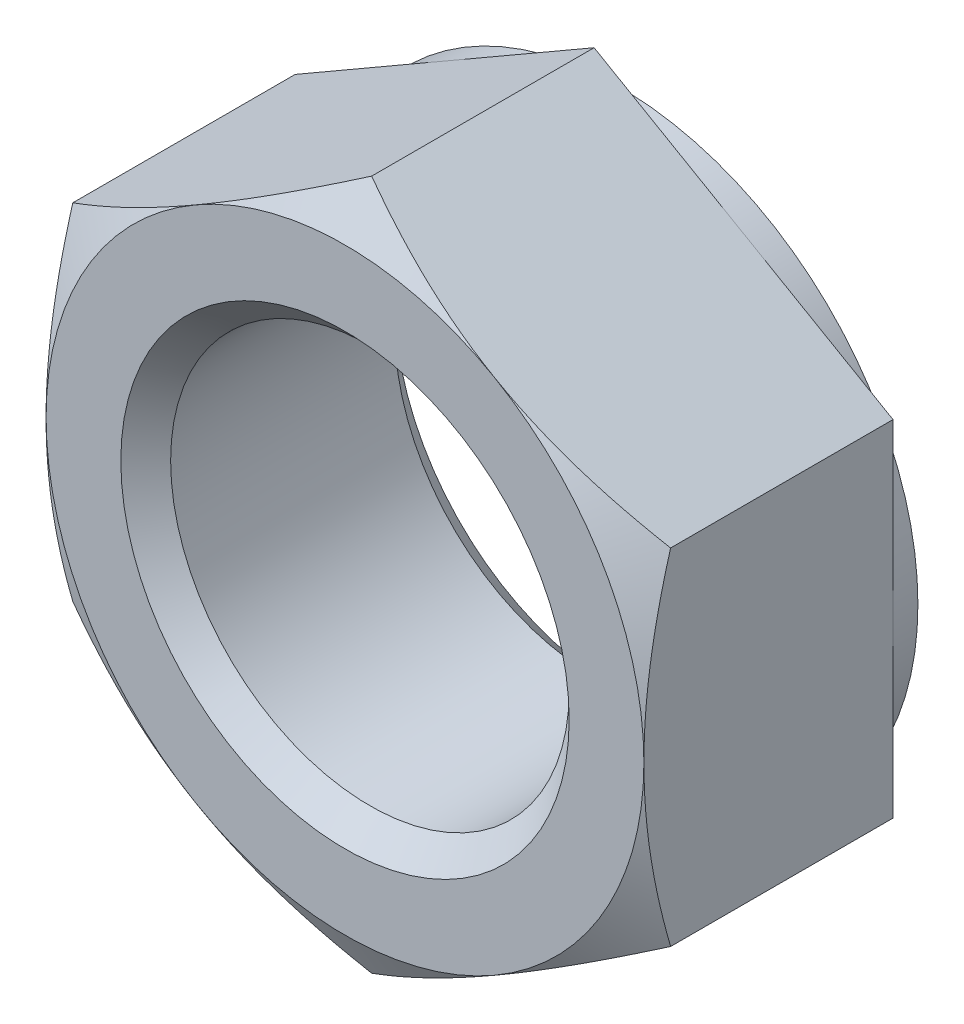
ISO-10303-21;
HEADER;
FILE_DESCRIPTION(('STEP AP214'),'2;1');
FILE_NAME('part.step','',(''),(''),'','','');
FILE_SCHEMA(('AUTOMOTIVE_DESIGN { 1 0 10303 214 1 1 1 1 }'));
ENDSEC;
DATA;
#1=APPLICATION_CONTEXT('core data for automotive mechanical design processes');
#2=APPLICATION_PROTOCOL_DEFINITION('international standard','automotive_design',2000,#1);
#3=PRODUCT_CONTEXT('',#1,'mechanical');
#4=PRODUCT('Part','Part','',(#3));
#5=PRODUCT_RELATED_PRODUCT_CATEGORY('part','',(#4));
#6=PRODUCT_DEFINITION_FORMATION('','',#4);
#7=PRODUCT_DEFINITION_CONTEXT('part definition',#1,'design');
#8=PRODUCT_DEFINITION('design','',#6,#7);
#9=PRODUCT_DEFINITION_SHAPE('','',#8);
#10=(LENGTH_UNIT() NAMED_UNIT(*) SI_UNIT(.MILLI.,.METRE.));
#11=(NAMED_UNIT(*) PLANE_ANGLE_UNIT() SI_UNIT($,.RADIAN.));
#12=(NAMED_UNIT(*) SI_UNIT($,.STERADIAN.) SOLID_ANGLE_UNIT());
#13=UNCERTAINTY_MEASURE_WITH_UNIT(LENGTH_MEASURE(1.E-05),#10,'distance_accuracy_value','');
#14=(GEOMETRIC_REPRESENTATION_CONTEXT(3) GLOBAL_UNCERTAINTY_ASSIGNED_CONTEXT((#13)) GLOBAL_UNIT_ASSIGNED_CONTEXT((#10,
#11,#12)) REPRESENTATION_CONTEXT('',''));
#15=CARTESIAN_POINT('',(0.,0.,0.));
#16=DIRECTION('',(0.,0.,1.));
#17=DIRECTION('',(1.,0.,0.));
#18=AXIS2_PLACEMENT_3D('',#15,#16,#17);
#19=CARTESIAN_POINT('',(0.,-3.46410161513775,0.));
#20=DIRECTION('',(-0.5,-0.866025403784439,0.));
#21=DIRECTION('',(0.,0.,-1.));
#22=AXIS2_PLACEMENT_3D('',#19,#20,#21);
#23=PLANE('',#22);
#24=CARTESIAN_POINT('',(-1.5,-2.59807621135332,1.25));
#25=CARTESIAN_POINT('',(-2.19615242270664,-2.19615242270663,1.25));
#26=CARTESIAN_POINT('',(-3.,-1.73205080756888,0.982050807568876));
#27=(BOUNDED_CURVE() B_SPLINE_CURVE(2,(#24,#25,#26),.UNSPECIFIED.,.F.,
.F.) B_SPLINE_CURVE_WITH_KNOTS((3,3),(0.418779721913687,0.628169582870529),
.UNSPECIFIED.) CURVE() GEOMETRIC_REPRESENTATION_ITEM() RATIONAL_B_SPLINE_CURVE((1.,
1.07735026918962,1.07735026918962)) REPRESENTATION_ITEM(''));
#28=CARTESIAN_POINT('',(-1.5,-2.59807621135332,1.25));
#29=VERTEX_POINT('',#28);
#30=CARTESIAN_POINT('',(-3.,-1.73205080756888,0.982050807568876));
#31=VERTEX_POINT('',#30);
#32=EDGE_CURVE('E146',#29,#31,#27,.T.);
#33=ORIENTED_EDGE('',*,*,#32,.T.);
#34=DIRECTION('',(0.,0.,-1.));
#35=VECTOR('',#34,1.);
#36=CARTESIAN_POINT('',(-3.,-1.73205080756888,0.));
#37=LINE('',#36,#35);
#38=CARTESIAN_POINT('',(-3.,-1.73205080756888,-1.25));
#39=VERTEX_POINT('',#38);
#40=EDGE_CURVE('E181',#31,#39,#37,.T.);
#41=ORIENTED_EDGE('',*,*,#40,.T.);
#42=DIRECTION('',(0.866025403784439,-0.5,0.));
#43=VECTOR('',#42,1.);
#44=CARTESIAN_POINT('',(0.,-3.46410161513775,-1.25));
#45=LINE('',#44,#43);
#46=CARTESIAN_POINT('',(-1.5,-2.59807621135332,-1.25));
#47=VERTEX_POINT('',#46);
#48=EDGE_CURVE('E134',#39,#47,#45,.T.);
#49=ORIENTED_EDGE('',*,*,#48,.T.);
#50=DIRECTION('',(0.866025403784439,-0.5,0.));
#51=VECTOR('',#50,1.);
#52=CARTESIAN_POINT('',(0.,-3.46410161513775,-1.25));
#53=LINE('',#52,#51);
#54=CARTESIAN_POINT('',(0.,-3.46410161513775,-1.25));
#55=VERTEX_POINT('',#54);
#56=EDGE_CURVE('E124',#47,#55,#53,.T.);
#57=ORIENTED_EDGE('',*,*,#56,.T.);
#58=DIRECTION('',(0.,0.,-1.));
#59=VECTOR('',#58,1.);
#60=CARTESIAN_POINT('',(0.,-3.46410161513775,0.));
#61=LINE('',#60,#59);
#62=CARTESIAN_POINT('',(0.,-3.46410161513775,0.982050807568876));
#63=VERTEX_POINT('',#62);
#64=EDGE_CURVE('E10',#63,#55,#61,.T.);
#65=ORIENTED_EDGE('',*,*,#64,.F.);
#66=CARTESIAN_POINT('',(0.,-3.46410161513776,0.982050807568876));
#67=CARTESIAN_POINT('',(-0.803847577293364,-3.00000000000001,1.25));
#68=CARTESIAN_POINT('',(-1.5,-2.59807621135332,1.25));
#69=(BOUNDED_CURVE() B_SPLINE_CURVE(2,(#66,#67,#68),.UNSPECIFIED.,.F.,
.F.) B_SPLINE_CURVE_WITH_KNOTS((3,3),(0.209389860956844,0.418779721913687),
.UNSPECIFIED.) CURVE() GEOMETRIC_REPRESENTATION_ITEM() RATIONAL_B_SPLINE_CURVE((1.07735026918963,
1.07735026918962,1.)) REPRESENTATION_ITEM(''));
#70=EDGE_CURVE('E242',#63,#29,#69,.T.);
#71=ORIENTED_EDGE('',*,*,#70,.T.);
#72=EDGE_LOOP('',(#33,#41,#49,#57,#65,#71));
#73=FACE_BOUND('',#72,.T.);
#74=ADVANCED_FACE('F15',(#73),#23,.T.);
#75=CARTESIAN_POINT('',(3.,-1.73205080756888,0.));
#76=DIRECTION('',(0.5,-0.866025403784439,0.));
#77=DIRECTION('',(0.,0.,-1.));
#78=AXIS2_PLACEMENT_3D('',#75,#76,#77);
#79=PLANE('',#78);
#80=CARTESIAN_POINT('',(1.5,-2.59807621135332,1.25));
#81=CARTESIAN_POINT('',(0.803847577293367,-3.00000000000001,1.25));
#82=CARTESIAN_POINT('',(0.,-3.46410161513776,0.982050807568876));
#83=(BOUNDED_CURVE() B_SPLINE_CURVE(2,(#80,#81,#82),.UNSPECIFIED.,.F.,
.F.) B_SPLINE_CURVE_WITH_KNOTS((3,3),(0.418779721913687,0.62816958287053),
.UNSPECIFIED.) CURVE() GEOMETRIC_REPRESENTATION_ITEM() RATIONAL_B_SPLINE_CURVE((1.,
1.07735026918962,1.07735026918962)) REPRESENTATION_ITEM(''));
#84=CARTESIAN_POINT('',(1.5,-2.59807621135332,1.25));
#85=VERTEX_POINT('',#84);
#86=EDGE_CURVE('E165',#85,#63,#83,.T.);
#87=ORIENTED_EDGE('',*,*,#86,.T.);
#88=ORIENTED_EDGE('',*,*,#64,.T.);
#89=DIRECTION('',(0.866025403784439,0.5,0.));
#90=VECTOR('',#89,1.);
#91=CARTESIAN_POINT('',(3.,-1.73205080756888,-1.25));
#92=LINE('',#91,#90);
#93=CARTESIAN_POINT('',(1.5,-2.59807621135332,-1.25));
#94=VERTEX_POINT('',#93);
#95=EDGE_CURVE('E117',#55,#94,#92,.T.);
#96=ORIENTED_EDGE('',*,*,#95,.T.);
#97=DIRECTION('',(0.866025403784439,0.5,0.));
#98=VECTOR('',#97,1.);
#99=CARTESIAN_POINT('',(3.,-1.73205080756888,-1.25));
#100=LINE('',#99,#98);
#101=CARTESIAN_POINT('',(3.,-1.73205080756888,-1.25));
#102=VERTEX_POINT('',#101);
#103=EDGE_CURVE('E104',#94,#102,#100,.T.);
#104=ORIENTED_EDGE('',*,*,#103,.T.);
#105=DIRECTION('',(0.,0.,-1.));
#106=VECTOR('',#105,1.);
#107=CARTESIAN_POINT('',(3.,-1.73205080756888,0.));
#108=LINE('',#107,#106);
#109=CARTESIAN_POINT('',(3.,-1.73205080756888,0.982050807568877));
#110=VERTEX_POINT('',#109);
#111=EDGE_CURVE('E26',#110,#102,#108,.T.);
#112=ORIENTED_EDGE('',*,*,#111,.F.);
#113=CARTESIAN_POINT('',(3.,-1.73205080756888,0.982050807568876));
#114=CARTESIAN_POINT('',(2.19615242270664,-2.19615242270664,1.25));
#115=CARTESIAN_POINT('',(1.5,-2.59807621135332,1.25));
#116=(BOUNDED_CURVE() B_SPLINE_CURVE(2,(#113,#114,#115),.UNSPECIFIED.,.F.,
.F.) B_SPLINE_CURVE_WITH_KNOTS((3,3),(0.209389860956845,0.418779721913687),
.UNSPECIFIED.) CURVE() GEOMETRIC_REPRESENTATION_ITEM() RATIONAL_B_SPLINE_CURVE((1.07735026918962,
1.07735026918962,1.)) REPRESENTATION_ITEM(''));
#117=EDGE_CURVE('E199',#110,#85,#116,.T.);
#118=ORIENTED_EDGE('',*,*,#117,.T.);
#119=EDGE_LOOP('',(#87,#88,#96,#104,#112,#118));
#120=FACE_BOUND('',#119,.T.);
#121=ADVANCED_FACE('F120',(#120),#79,.T.);
#122=CARTESIAN_POINT('',(3.,1.73205080756887,0.));
#123=DIRECTION('',(1.,0.,0.));
#124=DIRECTION('',(0.,0.,-1.));
#125=AXIS2_PLACEMENT_3D('',#122,#123,#124);
#126=PLANE('',#125);
#127=CARTESIAN_POINT('',(3.,0.,1.25));
#128=CARTESIAN_POINT('',(3.,-0.803847577293373,1.25));
#129=CARTESIAN_POINT('',(3.,-1.73205080756888,0.982050807568877));
#130=(BOUNDED_CURVE() B_SPLINE_CURVE(2,(#127,#128,#129),.UNSPECIFIED.,.F.,
.F.) B_SPLINE_CURVE_WITH_KNOTS((3,3),(0.418779721913687,0.62816958287053),
.UNSPECIFIED.) CURVE() GEOMETRIC_REPRESENTATION_ITEM() RATIONAL_B_SPLINE_CURVE((1.,
1.07735026918963,1.07735026918963)) REPRESENTATION_ITEM(''));
#131=CARTESIAN_POINT('',(3.,0.,1.25));
#132=VERTEX_POINT('',#131);
#133=EDGE_CURVE('E204',#132,#110,#130,.T.);
#134=ORIENTED_EDGE('',*,*,#133,.T.);
#135=ORIENTED_EDGE('',*,*,#111,.T.);
#136=DIRECTION('',(0.,1.,0.));
#137=VECTOR('',#136,1.);
#138=CARTESIAN_POINT('',(3.,1.73205080756887,-1.25));
#139=LINE('',#138,#137);
#140=CARTESIAN_POINT('',(3.,0.,-1.25));
#141=VERTEX_POINT('',#140);
#142=EDGE_CURVE('E19',#102,#141,#139,.T.);
#143=ORIENTED_EDGE('',*,*,#142,.T.);
#144=DIRECTION('',(0.,1.,0.));
#145=VECTOR('',#144,1.);
#146=CARTESIAN_POINT('',(3.,1.73205080756887,-1.25));
#147=LINE('',#146,#145);
#148=CARTESIAN_POINT('',(3.,1.73205080756887,-1.25));
#149=VERTEX_POINT('',#148);
#150=EDGE_CURVE('E195',#141,#149,#147,.T.);
#151=ORIENTED_EDGE('',*,*,#150,.T.);
#152=DIRECTION('',(0.,0.,-1.));
#153=VECTOR('',#152,1.);
#154=CARTESIAN_POINT('',(3.,1.73205080756887,0.));
#155=LINE('',#154,#153);
#156=CARTESIAN_POINT('',(3.,1.73205080756887,0.982050807568878));
#157=VERTEX_POINT('',#156);
#158=EDGE_CURVE('E35',#157,#149,#155,.T.);
#159=ORIENTED_EDGE('',*,*,#158,.F.);
#160=CARTESIAN_POINT('',(3.,1.73205080756888,0.982050807568877));
#161=CARTESIAN_POINT('',(3.,0.803847577293372,1.25));
#162=CARTESIAN_POINT('',(3.,0.,1.25));
#163=(BOUNDED_CURVE() B_SPLINE_CURVE(2,(#160,#161,#162),.UNSPECIFIED.,.F.,
.F.) B_SPLINE_CURVE_WITH_KNOTS((3,3),(0.209389860956845,0.418779721913687),
.UNSPECIFIED.) CURVE() GEOMETRIC_REPRESENTATION_ITEM() RATIONAL_B_SPLINE_CURVE((1.07735026918963,
1.07735026918963,1.)) REPRESENTATION_ITEM(''));
#164=EDGE_CURVE('E166',#157,#132,#163,.T.);
#165=ORIENTED_EDGE('',*,*,#164,.T.);
#166=EDGE_LOOP('',(#134,#135,#143,#151,#159,#165));
#167=FACE_BOUND('',#166,.T.);
#168=ADVANCED_FACE('F299',(#167),#126,.T.);
#169=CARTESIAN_POINT('',(0.,3.46410161513775,0.));
#170=DIRECTION('',(0.5,0.866025403784439,0.));
#171=DIRECTION('',(0.,0.,-1.));
#172=AXIS2_PLACEMENT_3D('',#169,#170,#171);
#173=PLANE('',#172);
#174=CARTESIAN_POINT('',(0.,3.46410161513775,0.982050807568877));
#175=CARTESIAN_POINT('',(0.803847577293363,3.,1.25));
#176=CARTESIAN_POINT('',(1.5,2.59807621135332,1.25));
#177=(BOUNDED_CURVE() B_SPLINE_CURVE(2,(#174,#175,#176),.UNSPECIFIED.,.F.,
.F.) B_SPLINE_CURVE_WITH_KNOTS((3,3),(0.209389860956844,0.418779721913688),
.UNSPECIFIED.) CURVE() GEOMETRIC_REPRESENTATION_ITEM() RATIONAL_B_SPLINE_CURVE((1.07735026918963,
1.07735026918963,1.)) REPRESENTATION_ITEM(''));
#178=CARTESIAN_POINT('',(0.,3.46410161513775,0.982050807568877));
#179=VERTEX_POINT('',#178);
#180=CARTESIAN_POINT('',(1.5,2.59807621135332,1.25));
#181=VERTEX_POINT('',#180);
#182=EDGE_CURVE('E155',#179,#181,#177,.T.);
#183=ORIENTED_EDGE('',*,*,#182,.T.);
#184=CARTESIAN_POINT('',(1.5,2.59807621135332,1.25));
#185=CARTESIAN_POINT('',(2.19615242270664,2.19615242270663,1.25));
#186=CARTESIAN_POINT('',(3.,1.73205080756888,0.982050807568877));
#187=(BOUNDED_CURVE() B_SPLINE_CURVE(2,(#184,#185,#186),.UNSPECIFIED.,.F.,
.F.) B_SPLINE_CURVE_WITH_KNOTS((3,3),(0.418779721913688,0.62816958287053),
.UNSPECIFIED.) CURVE() GEOMETRIC_REPRESENTATION_ITEM() RATIONAL_B_SPLINE_CURVE((1.,
1.07735026918962,1.07735026918962)) REPRESENTATION_ITEM(''));
#188=EDGE_CURVE('E174',#181,#157,#187,.T.);
#189=ORIENTED_EDGE('',*,*,#188,.T.);
#190=ORIENTED_EDGE('',*,*,#158,.T.);
#191=DIRECTION('',(-0.866025403784439,0.5,0.));
#192=VECTOR('',#191,1.);
#193=CARTESIAN_POINT('',(0.,3.46410161513775,-1.25));
#194=LINE('',#193,#192);
#195=CARTESIAN_POINT('',(1.5,2.59807621135332,-1.25));
#196=VERTEX_POINT('',#195);
#197=EDGE_CURVE('E114',#149,#196,#194,.T.);
#198=ORIENTED_EDGE('',*,*,#197,.T.);
#199=DIRECTION('',(-0.866025403784439,0.5,0.));
#200=VECTOR('',#199,1.);
#201=CARTESIAN_POINT('',(0.,3.46410161513775,-1.25));
#202=LINE('',#201,#200);
#203=CARTESIAN_POINT('',(0.,3.46410161513775,-1.25));
#204=VERTEX_POINT('',#203);
#205=EDGE_CURVE('E216',#196,#204,#202,.T.);
#206=ORIENTED_EDGE('',*,*,#205,.T.);
#207=DIRECTION('',(0.,0.,1.));
#208=VECTOR('',#207,1.);
#209=CARTESIAN_POINT('',(0.,3.46410161513775,0.));
#210=LINE('',#209,#208);
#211=EDGE_CURVE('E184',#204,#179,#210,.T.);
#212=ORIENTED_EDGE('',*,*,#211,.T.);
#213=EDGE_LOOP('',(#183,#189,#190,#198,#206,#212));
#214=FACE_BOUND('',#213,.T.);
#215=ADVANCED_FACE('F353',(#214),#173,.T.);
#216=CARTESIAN_POINT('',(-3.,1.73205080756887,0.));
#217=DIRECTION('',(-0.5,0.866025403784438,0.));
#218=DIRECTION('',(0.,0.,1.));
#219=AXIS2_PLACEMENT_3D('',#216,#217,#218);
#220=PLANE('',#219);
#221=CARTESIAN_POINT('',(-3.,1.73205080756887,0.982050807568876));
#222=CARTESIAN_POINT('',(-2.19615242270664,2.19615242270663,1.25));
#223=CARTESIAN_POINT('',(-1.5,2.59807621135332,1.25));
#224=(BOUNDED_CURVE() B_SPLINE_CURVE(2,(#221,#222,#223),.UNSPECIFIED.,.F.,
.F.) B_SPLINE_CURVE_WITH_KNOTS((3,3),(0.209389860956844,0.418779721913687),
.UNSPECIFIED.) CURVE() GEOMETRIC_REPRESENTATION_ITEM() RATIONAL_B_SPLINE_CURVE((1.07735026918962,
1.07735026918962,1.)) REPRESENTATION_ITEM(''));
#225=CARTESIAN_POINT('',(-3.,1.73205080756887,0.982050807568877));
#226=VERTEX_POINT('',#225);
#227=CARTESIAN_POINT('',(-1.5,2.59807621135332,1.25));
#228=VERTEX_POINT('',#227);
#229=EDGE_CURVE('E156',#226,#228,#224,.T.);
#230=ORIENTED_EDGE('',*,*,#229,.T.);
#231=CARTESIAN_POINT('',(-1.5,2.59807621135332,1.25));
#232=CARTESIAN_POINT('',(-0.803847577293369,3.,1.25));
#233=CARTESIAN_POINT('',(0.,3.46410161513775,0.982050807568877));
#234=(BOUNDED_CURVE() B_SPLINE_CURVE(2,(#231,#232,#233),.UNSPECIFIED.,.F.,
.F.) B_SPLINE_CURVE_WITH_KNOTS((3,3),(0.418779721913687,0.62816958287053),
.UNSPECIFIED.) CURVE() GEOMETRIC_REPRESENTATION_ITEM() RATIONAL_B_SPLINE_CURVE((1.,
1.07735026918962,1.07735026918962)) REPRESENTATION_ITEM(''));
#235=EDGE_CURVE('E150',#228,#179,#234,.T.);
#236=ORIENTED_EDGE('',*,*,#235,.T.);
#237=ORIENTED_EDGE('',*,*,#211,.F.);
#238=DIRECTION('',(-0.866025403784438,-0.5,0.));
#239=VECTOR('',#238,1.);
#240=CARTESIAN_POINT('',(-3.,1.73205080756887,-1.25));
#241=LINE('',#240,#239);
#242=CARTESIAN_POINT('',(-1.5,2.59807621135332,-1.25));
#243=VERTEX_POINT('',#242);
#244=EDGE_CURVE('E198',#204,#243,#241,.T.);
#245=ORIENTED_EDGE('',*,*,#244,.T.);
#246=DIRECTION('',(-0.866025403784438,-0.5,0.));
#247=VECTOR('',#246,1.);
#248=CARTESIAN_POINT('',(-3.,1.73205080756887,-1.25));
#249=LINE('',#248,#247);
#250=CARTESIAN_POINT('',(-3.,1.73205080756887,-1.25));
#251=VERTEX_POINT('',#250);
#252=EDGE_CURVE('E205',#243,#251,#249,.T.);
#253=ORIENTED_EDGE('',*,*,#252,.T.);
#254=DIRECTION('',(0.,0.,-1.));
#255=VECTOR('',#254,1.);
#256=CARTESIAN_POINT('',(-3.,1.73205080756887,0.));
#257=LINE('',#256,#255);
#258=EDGE_CURVE('E173',#226,#251,#257,.T.);
#259=ORIENTED_EDGE('',*,*,#258,.F.);
#260=EDGE_LOOP('',(#230,#236,#237,#245,#253,#259));
#261=FACE_BOUND('',#260,.T.);
#262=ADVANCED_FACE('F335',(#261),#220,.T.);
#263=CARTESIAN_POINT('',(-3.,-1.73205080756888,0.));
#264=DIRECTION('',(-1.,0.,0.));
#265=DIRECTION('',(0.,0.,1.));
#266=AXIS2_PLACEMENT_3D('',#263,#264,#265);
#267=PLANE('',#266);
#268=CARTESIAN_POINT('',(-3.,-1.73205080756888,0.982050807568877));
#269=CARTESIAN_POINT('',(-3.,-0.803847577293375,1.25));
#270=CARTESIAN_POINT('',(-3.,0.,1.25));
#271=(BOUNDED_CURVE() B_SPLINE_CURVE(2,(#268,#269,#270),.UNSPECIFIED.,.F.,
.F.) B_SPLINE_CURVE_WITH_KNOTS((3,3),(0.209389860956844,0.418779721913687),
.UNSPECIFIED.) CURVE() GEOMETRIC_REPRESENTATION_ITEM() RATIONAL_B_SPLINE_CURVE((1.07735026918963,
1.07735026918963,1.)) REPRESENTATION_ITEM(''));
#272=CARTESIAN_POINT('',(-3.,0.,1.25));
#273=VERTEX_POINT('',#272);
#274=EDGE_CURVE('E157',#31,#273,#271,.T.);
#275=ORIENTED_EDGE('',*,*,#274,.T.);
#276=CARTESIAN_POINT('',(-3.,0.,1.25));
#277=CARTESIAN_POINT('',(-3.00000000000001,0.803847577293372,1.25));
#278=CARTESIAN_POINT('',(-3.00000000000001,1.73205080756887,0.982050807568877));
#279=(BOUNDED_CURVE() B_SPLINE_CURVE(2,(#276,#277,#278),.UNSPECIFIED.,.F.,
.F.) B_SPLINE_CURVE_WITH_KNOTS((3,3),(0.418779721913687,0.628169582870529),
.UNSPECIFIED.) CURVE() GEOMETRIC_REPRESENTATION_ITEM() RATIONAL_B_SPLINE_CURVE((1.,
1.07735026918963,1.07735026918963)) REPRESENTATION_ITEM(''));
#280=EDGE_CURVE('E232',#273,#226,#279,.T.);
#281=ORIENTED_EDGE('',*,*,#280,.T.);
#282=ORIENTED_EDGE('',*,*,#258,.T.);
#283=DIRECTION('',(0.,-1.,0.));
#284=VECTOR('',#283,1.);
#285=CARTESIAN_POINT('',(-3.,-1.73205080756888,-1.25));
#286=LINE('',#285,#284);
#287=CARTESIAN_POINT('',(-3.,0.,-1.25));
#288=VERTEX_POINT('',#287);
#289=EDGE_CURVE('E220',#251,#288,#286,.T.);
#290=ORIENTED_EDGE('',*,*,#289,.T.);
#291=DIRECTION('',(0.,-1.,0.));
#292=VECTOR('',#291,1.);
#293=CARTESIAN_POINT('',(-3.,-1.73205080756888,-1.25));
#294=LINE('',#293,#292);
#295=EDGE_CURVE('E125',#288,#39,#294,.T.);
#296=ORIENTED_EDGE('',*,*,#295,.T.);
#297=ORIENTED_EDGE('',*,*,#40,.F.);
#298=EDGE_LOOP('',(#275,#281,#282,#290,#296,#297));
#299=FACE_BOUND('',#298,.T.);
#300=ADVANCED_FACE('F344',(#299),#267,.T.);
#301=CARTESIAN_POINT('',(0.,0.,0.672649730810374));
#302=DIRECTION('',(0.,0.,-1.));
#303=DIRECTION('',(1.,0.,0.));
#304=AXIS2_PLACEMENT_3D('',#301,#302,#303);
#305=CONICAL_SURFACE('',#304,4.,1.0471975511966);
#306=ORIENTED_EDGE('',*,*,#188,.F.);
#307=CARTESIAN_POINT('',(0.,0.,1.25));
#308=DIRECTION('',(0.,0.,1.));
#309=DIRECTION('',(1.,0.,0.));
#310=AXIS2_PLACEMENT_3D('',#307,#308,#309);
#311=CIRCLE('',#310,3.);
#312=EDGE_CURVE('E185',#132,#181,#311,.T.);
#313=ORIENTED_EDGE('',*,*,#312,.F.);
#314=ORIENTED_EDGE('',*,*,#164,.F.);
#315=EDGE_LOOP('',(#306,#313,#314));
#316=FACE_BOUND('',#315,.T.);
#317=ADVANCED_FACE('F389',(#316),#305,.T.);
#318=CARTESIAN_POINT('',(0.,0.,0.672649730810374));
#319=DIRECTION('',(0.,0.,-1.));
#320=DIRECTION('',(1.,0.,0.));
#321=AXIS2_PLACEMENT_3D('',#318,#319,#320);
#322=CONICAL_SURFACE('',#321,4.,1.0471975511966);
#323=ORIENTED_EDGE('',*,*,#235,.F.);
#324=CARTESIAN_POINT('',(0.,0.,1.25));
#325=DIRECTION('',(0.,0.,1.));
#326=DIRECTION('',(1.,0.,0.));
#327=AXIS2_PLACEMENT_3D('',#324,#325,#326);
#328=CIRCLE('',#327,3.);
#329=EDGE_CURVE('E188',#181,#228,#328,.T.);
#330=ORIENTED_EDGE('',*,*,#329,.F.);
#331=ORIENTED_EDGE('',*,*,#182,.F.);
#332=EDGE_LOOP('',(#323,#330,#331));
#333=FACE_BOUND('',#332,.T.);
#334=ADVANCED_FACE('F403',(#333),#322,.T.);
#335=CARTESIAN_POINT('',(0.,0.,0.672649730810374));
#336=DIRECTION('',(0.,0.,-1.));
#337=DIRECTION('',(1.,0.,0.));
#338=AXIS2_PLACEMENT_3D('',#335,#336,#337);
#339=CONICAL_SURFACE('',#338,4.,1.0471975511966);
#340=ORIENTED_EDGE('',*,*,#280,.F.);
#341=CARTESIAN_POINT('',(0.,0.,1.25));
#342=DIRECTION('',(0.,0.,1.));
#343=DIRECTION('',(1.,0.,0.));
#344=AXIS2_PLACEMENT_3D('',#341,#342,#343);
#345=CIRCLE('',#344,3.);
#346=EDGE_CURVE('E206',#228,#273,#345,.T.);
#347=ORIENTED_EDGE('',*,*,#346,.F.);
#348=ORIENTED_EDGE('',*,*,#229,.F.);
#349=EDGE_LOOP('',(#340,#347,#348));
#350=FACE_BOUND('',#349,.T.);
#351=ADVANCED_FACE('F400',(#350),#339,.T.);
#352=CARTESIAN_POINT('',(0.,0.,0.672649730810374));
#353=DIRECTION('',(0.,0.,-1.));
#354=DIRECTION('',(1.,0.,0.));
#355=AXIS2_PLACEMENT_3D('',#352,#353,#354);
#356=CONICAL_SURFACE('',#355,4.,1.0471975511966);
#357=ORIENTED_EDGE('',*,*,#274,.F.);
#358=ORIENTED_EDGE('',*,*,#32,.F.);
#359=CARTESIAN_POINT('',(0.,0.,1.25));
#360=DIRECTION('',(0.,0.,1.));
#361=DIRECTION('',(1.,0.,0.));
#362=AXIS2_PLACEMENT_3D('',#359,#360,#361);
#363=CIRCLE('',#362,3.);
#364=EDGE_CURVE('E212',#273,#29,#363,.T.);
#365=ORIENTED_EDGE('',*,*,#364,.F.);
#366=EDGE_LOOP('',(#357,#358,#365));
#367=FACE_BOUND('',#366,.T.);
#368=ADVANCED_FACE('F397',(#367),#356,.T.);
#369=CARTESIAN_POINT('',(0.,0.,0.672649730810374));
#370=DIRECTION('',(0.,0.,-1.));
#371=DIRECTION('',(1.,0.,0.));
#372=AXIS2_PLACEMENT_3D('',#369,#370,#371);
#373=CONICAL_SURFACE('',#372,4.,1.0471975511966);
#374=ORIENTED_EDGE('',*,*,#70,.F.);
#375=ORIENTED_EDGE('',*,*,#86,.F.);
#376=CARTESIAN_POINT('',(0.,0.,1.25));
#377=DIRECTION('',(0.,0.,1.));
#378=DIRECTION('',(1.,0.,0.));
#379=AXIS2_PLACEMENT_3D('',#376,#377,#378);
#380=CIRCLE('',#379,3.);
#381=EDGE_CURVE('E194',#29,#85,#380,.T.);
#382=ORIENTED_EDGE('',*,*,#381,.F.);
#383=EDGE_LOOP('',(#374,#375,#382));
#384=FACE_BOUND('',#383,.T.);
#385=ADVANCED_FACE('F308',(#384),#373,.T.);
#386=CARTESIAN_POINT('',(0.,0.,0.672649730810374));
#387=DIRECTION('',(0.,0.,-1.));
#388=DIRECTION('',(1.,0.,0.));
#389=AXIS2_PLACEMENT_3D('',#386,#387,#388);
#390=CONICAL_SURFACE('',#389,4.,1.0471975511966);
#391=ORIENTED_EDGE('',*,*,#117,.F.);
#392=ORIENTED_EDGE('',*,*,#133,.F.);
#393=CARTESIAN_POINT('',(0.,0.,1.25));
#394=DIRECTION('',(0.,0.,1.));
#395=DIRECTION('',(1.,0.,0.));
#396=AXIS2_PLACEMENT_3D('',#393,#394,#395);
#397=CIRCLE('',#396,3.);
#398=EDGE_CURVE('E190',#85,#132,#397,.T.);
#399=ORIENTED_EDGE('',*,*,#398,.F.);
#400=EDGE_LOOP('',(#391,#392,#399));
#401=FACE_BOUND('',#400,.T.);
#402=ADVANCED_FACE('F303',(#401),#390,.T.);
#403=CARTESIAN_POINT('',(0.,0.,-1.25));
#404=DIRECTION('',(0.,0.,1.));
#405=DIRECTION('',(1.,0.,0.));
#406=AXIS2_PLACEMENT_3D('',#403,#404,#405);
#407=PLANE('',#406);
#408=CARTESIAN_POINT('',(0.,0.,-1.25));
#409=DIRECTION('',(0.,0.,1.));
#410=DIRECTION('',(1.,0.,0.));
#411=AXIS2_PLACEMENT_3D('',#408,#409,#410);
#412=CIRCLE('',#411,3.);
#413=EDGE_CURVE('E213',#243,#288,#412,.T.);
#414=ORIENTED_EDGE('',*,*,#413,.T.);
#415=ORIENTED_EDGE('',*,*,#289,.F.);
#416=ORIENTED_EDGE('',*,*,#252,.F.);
#417=EDGE_LOOP('',(#414,#415,#416));
#418=FACE_BOUND('',#417,.T.);
#419=ADVANCED_FACE('F340',(#418),#407,.F.);
#420=CARTESIAN_POINT('',(0.,0.,-1.25));
#421=DIRECTION('',(0.,0.,1.));
#422=DIRECTION('',(1.,0.,0.));
#423=AXIS2_PLACEMENT_3D('',#420,#421,#422);
#424=PLANE('',#423);
#425=CARTESIAN_POINT('',(0.,0.,-1.25));
#426=DIRECTION('',(0.,0.,1.));
#427=DIRECTION('',(1.,0.,0.));
#428=AXIS2_PLACEMENT_3D('',#425,#426,#427);
#429=CIRCLE('',#428,3.);
#430=EDGE_CURVE('E142',#196,#243,#429,.T.);
#431=ORIENTED_EDGE('',*,*,#430,.T.);
#432=ORIENTED_EDGE('',*,*,#244,.F.);
#433=ORIENTED_EDGE('',*,*,#205,.F.);
#434=EDGE_LOOP('',(#431,#432,#433));
#435=FACE_BOUND('',#434,.T.);
#436=ADVANCED_FACE('F350',(#435),#424,.F.);
#437=CARTESIAN_POINT('',(0.,0.,-1.25));
#438=DIRECTION('',(0.,0.,1.));
#439=DIRECTION('',(1.,0.,0.));
#440=AXIS2_PLACEMENT_3D('',#437,#438,#439);
#441=PLANE('',#440);
#442=CARTESIAN_POINT('',(0.,0.,-1.25));
#443=DIRECTION('',(0.,0.,1.));
#444=DIRECTION('',(1.,0.,0.));
#445=AXIS2_PLACEMENT_3D('',#442,#443,#444);
#446=CIRCLE('',#445,3.);
#447=EDGE_CURVE('E140',#141,#196,#446,.T.);
#448=ORIENTED_EDGE('',*,*,#447,.T.);
#449=ORIENTED_EDGE('',*,*,#197,.F.);
#450=ORIENTED_EDGE('',*,*,#150,.F.);
#451=EDGE_LOOP('',(#448,#449,#450));
#452=FACE_BOUND('',#451,.T.);
#453=ADVANCED_FACE('F355',(#452),#441,.F.);
#454=CARTESIAN_POINT('',(0.,0.,-1.25));
#455=DIRECTION('',(0.,0.,1.));
#456=DIRECTION('',(1.,0.,0.));
#457=AXIS2_PLACEMENT_3D('',#454,#455,#456);
#458=PLANE('',#457);
#459=CARTESIAN_POINT('',(0.,0.,-1.25));
#460=DIRECTION('',(0.,0.,1.));
#461=DIRECTION('',(1.,0.,0.));
#462=AXIS2_PLACEMENT_3D('',#459,#460,#461);
#463=CIRCLE('',#462,3.);
#464=EDGE_CURVE('E108',#94,#141,#463,.T.);
#465=ORIENTED_EDGE('',*,*,#464,.T.);
#466=ORIENTED_EDGE('',*,*,#142,.F.);
#467=ORIENTED_EDGE('',*,*,#103,.F.);
#468=EDGE_LOOP('',(#465,#466,#467));
#469=FACE_BOUND('',#468,.T.);
#470=ADVANCED_FACE('F106',(#469),#458,.F.);
#471=CARTESIAN_POINT('',(0.,0.,-1.25));
#472=DIRECTION('',(0.,0.,1.));
#473=DIRECTION('',(1.,0.,0.));
#474=AXIS2_PLACEMENT_3D('',#471,#472,#473);
#475=PLANE('',#474);
#476=CARTESIAN_POINT('',(0.,0.,-1.25));
#477=DIRECTION('',(0.,0.,1.));
#478=DIRECTION('',(1.,0.,0.));
#479=AXIS2_PLACEMENT_3D('',#476,#477,#478);
#480=CIRCLE('',#479,3.);
#481=EDGE_CURVE('E128',#47,#94,#480,.T.);
#482=ORIENTED_EDGE('',*,*,#481,.T.);
#483=ORIENTED_EDGE('',*,*,#95,.F.);
#484=ORIENTED_EDGE('',*,*,#56,.F.);
#485=EDGE_LOOP('',(#482,#483,#484));
#486=FACE_BOUND('',#485,.T.);
#487=ADVANCED_FACE('F129',(#486),#475,.F.);
#488=CARTESIAN_POINT('',(0.,0.,-1.25));
#489=DIRECTION('',(0.,0.,1.));
#490=DIRECTION('',(1.,0.,0.));
#491=AXIS2_PLACEMENT_3D('',#488,#489,#490);
#492=PLANE('',#491);
#493=CARTESIAN_POINT('',(0.,0.,-1.25));
#494=DIRECTION('',(0.,0.,1.));
#495=DIRECTION('',(1.,0.,0.));
#496=AXIS2_PLACEMENT_3D('',#493,#494,#495);
#497=CIRCLE('',#496,3.);
#498=EDGE_CURVE('E193',#288,#47,#497,.T.);
#499=ORIENTED_EDGE('',*,*,#498,.T.);
#500=ORIENTED_EDGE('',*,*,#48,.F.);
#501=ORIENTED_EDGE('',*,*,#295,.F.);
#502=EDGE_LOOP('',(#499,#500,#501));
#503=FACE_BOUND('',#502,.T.);
#504=ADVANCED_FACE('F348',(#503),#492,.F.);
#505=CARTESIAN_POINT('',(0.,0.,-1.25));
#506=DIRECTION('',(0.,0.,1.));
#507=DIRECTION('',(1.,0.,0.));
#508=AXIS2_PLACEMENT_3D('',#505,#506,#507);
#509=CYLINDRICAL_SURFACE('',#508,3.);
#510=ORIENTED_EDGE('',*,*,#498,.F.);
#511=ORIENTED_EDGE('',*,*,#413,.F.);
#512=ORIENTED_EDGE('',*,*,#430,.F.);
#513=ORIENTED_EDGE('',*,*,#447,.F.);
#514=ORIENTED_EDGE('',*,*,#464,.F.);
#515=ORIENTED_EDGE('',*,*,#481,.F.);
#516=EDGE_LOOP('',(#510,#511,#512,#513,#514,#515));
#517=FACE_BOUND('',#516,.T.);
#518=CARTESIAN_POINT('',(0.,0.,-1.5));
#519=DIRECTION('',(0.,0.,1.));
#520=DIRECTION('',(1.,0.,0.));
#521=AXIS2_PLACEMENT_3D('',#518,#519,#520);
#522=CIRCLE('',#521,3.);
#523=CARTESIAN_POINT('',(-3.,0.,-1.5));
#524=VERTEX_POINT('',#523);
#525=EDGE_CURVE('E279',#524,#524,#522,.T.);
#526=ORIENTED_EDGE('',*,*,#525,.T.);
#527=EDGE_LOOP('',(#526));
#528=FACE_BOUND('',#527,.T.);
#529=ADVANCED_FACE('F136',(#517,#528),#509,.T.);
#530=CARTESIAN_POINT('',(0.,0.,1.25));
#531=DIRECTION('',(0.,0.,1.));
#532=DIRECTION('',(1.,0.,0.));
#533=AXIS2_PLACEMENT_3D('',#530,#531,#532);
#534=PLANE('',#533);
#535=CARTESIAN_POINT('',(0.,0.,1.25));
#536=DIRECTION('',(0.,0.,1.));
#537=DIRECTION('',(-1.,0.,0.));
#538=AXIS2_PLACEMENT_3D('',#535,#536,#537);
#539=CIRCLE('',#538,2.25);
#540=CARTESIAN_POINT('',(2.25,0.,1.25));
#541=VERTEX_POINT('',#540);
#542=EDGE_CURVE('E189',#541,#541,#539,.T.);
#543=ORIENTED_EDGE('',*,*,#542,.F.);
#544=EDGE_LOOP('',(#543));
#545=FACE_BOUND('',#544,.T.);
#546=ORIENTED_EDGE('',*,*,#312,.T.);
#547=ORIENTED_EDGE('',*,*,#329,.T.);
#548=ORIENTED_EDGE('',*,*,#346,.T.);
#549=ORIENTED_EDGE('',*,*,#364,.T.);
#550=ORIENTED_EDGE('',*,*,#381,.T.);
#551=ORIENTED_EDGE('',*,*,#398,.T.);
#552=EDGE_LOOP('',(#546,#547,#548,#549,#550,#551));
#553=FACE_BOUND('',#552,.T.);
#554=ADVANCED_FACE('F373',(#545,#553),#534,.T.);
#555=CARTESIAN_POINT('',(0.,0.,1.125));
#556=DIRECTION('',(0.,0.,1.));
#557=DIRECTION('',(-1.,0.,0.));
#558=AXIS2_PLACEMENT_3D('',#555,#556,#557);
#559=CONICAL_SURFACE('',#558,2.125,0.785398163397448);
#560=ORIENTED_EDGE('',*,*,#542,.T.);
#561=EDGE_LOOP('',(#560));
#562=FACE_BOUND('',#561,.T.);
#563=CARTESIAN_POINT('',(0.,0.,1.));
#564=DIRECTION('',(0.,0.,-1.));
#565=DIRECTION('',(-1.,0.,0.));
#566=AXIS2_PLACEMENT_3D('',#563,#564,#565);
#567=CIRCLE('',#566,2.);
#568=CARTESIAN_POINT('',(2.,0.,1.));
#569=VERTEX_POINT('',#568);
#570=EDGE_CURVE('E274',#569,#569,#567,.T.);
#571=ORIENTED_EDGE('',*,*,#570,.T.);
#572=EDGE_LOOP('',(#571));
#573=FACE_BOUND('',#572,.T.);
#574=ADVANCED_FACE('F375',(#562,#573),#559,.F.);
#575=CARTESIAN_POINT('',(0.,0.,-1.5));
#576=DIRECTION('',(0.,0.,1.));
#577=DIRECTION('',(1.,0.,0.));
#578=AXIS2_PLACEMENT_3D('',#575,#576,#577);
#579=PLANE('',#578);
#580=CARTESIAN_POINT('',(0.,0.,-1.5));
#581=DIRECTION('',(0.,0.,-1.));
#582=DIRECTION('',(1.,0.,0.));
#583=AXIS2_PLACEMENT_3D('',#580,#581,#582);
#584=CIRCLE('',#583,2.25);
#585=CARTESIAN_POINT('',(-2.25,0.,-1.5));
#586=VERTEX_POINT('',#585);
#587=EDGE_CURVE('E240',#586,#586,#584,.T.);
#588=ORIENTED_EDGE('',*,*,#587,.F.);
#589=EDGE_LOOP('',(#588));
#590=FACE_BOUND('',#589,.T.);
#591=ORIENTED_EDGE('',*,*,#525,.F.);
#592=EDGE_LOOP('',(#591));
#593=FACE_BOUND('',#592,.T.);
#594=ADVANCED_FACE('F17',(#590,#593),#579,.F.);
#595=CARTESIAN_POINT('',(0.,0.,-8.31882960450232));
#596=DIRECTION('',(0.,0.,-1.));
#597=DIRECTION('',(1.,0.,0.));
#598=AXIS2_PLACEMENT_3D('',#595,#596,#597);
#599=CYLINDRICAL_SURFACE('',#598,2.);
#600=CARTESIAN_POINT('',(0.,0.,-1.25));
#601=DIRECTION('',(0.,0.,1.));
#602=DIRECTION('',(1.,0.,0.));
#603=AXIS2_PLACEMENT_3D('',#600,#601,#602);
#604=CIRCLE('',#603,2.);
#605=CARTESIAN_POINT('',(-2.,0.,-1.25));
#606=VERTEX_POINT('',#605);
#607=EDGE_CURVE('E238',#606,#606,#604,.T.);
#608=ORIENTED_EDGE('',*,*,#607,.F.);
#609=EDGE_LOOP('',(#608));
#610=FACE_BOUND('',#609,.T.);
#611=ORIENTED_EDGE('',*,*,#570,.F.);
#612=EDGE_LOOP('',(#611));
#613=FACE_BOUND('',#612,.T.);
#614=ADVANCED_FACE('F422',(#610,#613),#599,.F.);
#615=CARTESIAN_POINT('',(0.,0.,-1.375));
#616=DIRECTION('',(0.,0.,-1.));
#617=DIRECTION('',(1.,0.,0.));
#618=AXIS2_PLACEMENT_3D('',#615,#616,#617);
#619=CONICAL_SURFACE('',#618,2.125,0.785398163397448);
#620=ORIENTED_EDGE('',*,*,#587,.T.);
#621=EDGE_LOOP('',(#620));
#622=FACE_BOUND('',#621,.T.);
#623=ORIENTED_EDGE('',*,*,#607,.T.);
#624=EDGE_LOOP('',(#623));
#625=FACE_BOUND('',#624,.T.);
#626=ADVANCED_FACE('F419',(#622,#625),#619,.F.);
#627=CLOSED_SHELL('',(#74,#121,#168,#215,#262,#300,#317,#334,#351,#368,#385,#402,#419,#436,#453,
#470,#487,#504,#529,#554,#574,#594,#614,#626));
#628=MANIFOLD_SOLID_BREP('B1',#627);
#629=ADVANCED_BREP_SHAPE_REPRESENTATION('',(#18,#628),#14);
#630=SHAPE_DEFINITION_REPRESENTATION(#9,#629);
ENDSEC;
END-ISO-10303-21;
